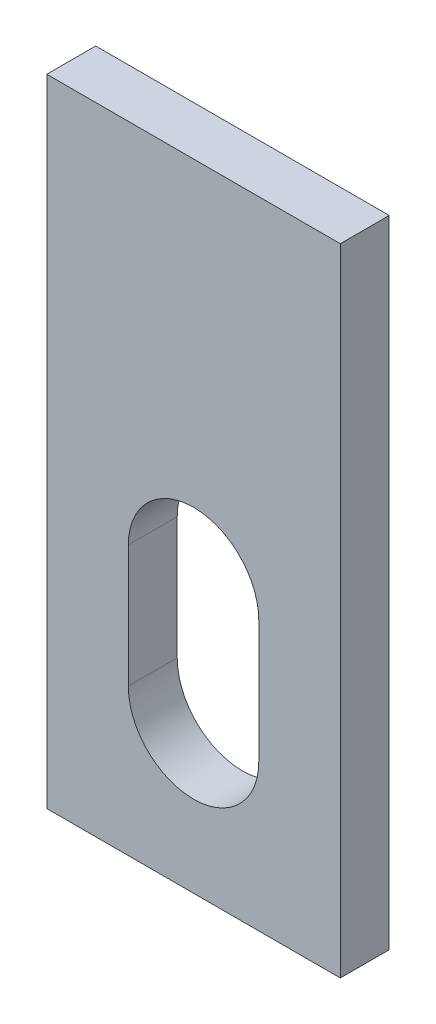
ISO-10303-21;
HEADER;
FILE_DESCRIPTION(('STEP AP214'),'2;1');
FILE_NAME('part.step','',(''),(''),'','','');
FILE_SCHEMA(('AUTOMOTIVE_DESIGN { 1 0 10303 214 1 1 1 1 }'));
ENDSEC;
DATA;
#1=APPLICATION_CONTEXT('core data for automotive mechanical design processes');
#2=APPLICATION_PROTOCOL_DEFINITION('international standard','automotive_design',2000,#1);
#3=PRODUCT_CONTEXT('',#1,'mechanical');
#4=PRODUCT('Part','Part','',(#3));
#5=PRODUCT_RELATED_PRODUCT_CATEGORY('part','',(#4));
#6=PRODUCT_DEFINITION_FORMATION('','',#4);
#7=PRODUCT_DEFINITION_CONTEXT('part definition',#1,'design');
#8=PRODUCT_DEFINITION('design','',#6,#7);
#9=PRODUCT_DEFINITION_SHAPE('','',#8);
#10=(LENGTH_UNIT() NAMED_UNIT(*) SI_UNIT(.MILLI.,.METRE.));
#11=(NAMED_UNIT(*) PLANE_ANGLE_UNIT() SI_UNIT($,.RADIAN.));
#12=(NAMED_UNIT(*) SI_UNIT($,.STERADIAN.) SOLID_ANGLE_UNIT());
#13=UNCERTAINTY_MEASURE_WITH_UNIT(LENGTH_MEASURE(1.E-05),#10,'distance_accuracy_value','');
#14=(GEOMETRIC_REPRESENTATION_CONTEXT(3) GLOBAL_UNCERTAINTY_ASSIGNED_CONTEXT((#13)) GLOBAL_UNIT_ASSIGNED_CONTEXT((#10,
#11,#12)) REPRESENTATION_CONTEXT('',''));
#15=CARTESIAN_POINT('',(0.,0.,0.));
#16=DIRECTION('',(0.,0.,1.));
#17=DIRECTION('',(1.,0.,0.));
#18=AXIS2_PLACEMENT_3D('',#15,#16,#17);
#19=CARTESIAN_POINT('',(0.,0.,10.));
#20=DIRECTION('',(0.,0.,1.));
#21=DIRECTION('',(1.,0.,0.));
#22=AXIS2_PLACEMENT_3D('',#19,#20,#21);
#23=PLANE('',#22);
#24=DIRECTION('',(0.,-1.,0.));
#25=VECTOR('',#24,1.);
#26=CARTESIAN_POINT('',(0.,0.,10.));
#27=LINE('',#26,#25);
#28=CARTESIAN_POINT('',(0.,0.,10.));
#29=VERTEX_POINT('',#28);
#30=CARTESIAN_POINT('',(0.,-130.,10.));
#31=VERTEX_POINT('',#30);
#32=EDGE_CURVE('E136',#29,#31,#27,.T.);
#33=ORIENTED_EDGE('',*,*,#32,.T.);
#34=DIRECTION('',(1.,0.,0.));
#35=VECTOR('',#34,1.);
#36=CARTESIAN_POINT('',(0.,-130.,10.));
#37=LINE('',#36,#35);
#38=CARTESIAN_POINT('',(60.,-130.,10.));
#39=VERTEX_POINT('',#38);
#40=EDGE_CURVE('E139',#31,#39,#37,.T.);
#41=ORIENTED_EDGE('',*,*,#40,.T.);
#42=DIRECTION('',(0.,1.,0.));
#43=VECTOR('',#42,1.);
#44=CARTESIAN_POINT('',(60.,0.,10.));
#45=LINE('',#44,#43);
#46=CARTESIAN_POINT('',(60.,0.,10.));
#47=VERTEX_POINT('',#46);
#48=EDGE_CURVE('E142',#39,#47,#45,.T.);
#49=ORIENTED_EDGE('',*,*,#48,.T.);
#50=DIRECTION('',(-1.,0.,0.));
#51=VECTOR('',#50,1.);
#52=CARTESIAN_POINT('',(0.,0.,10.));
#53=LINE('',#52,#51);
#54=EDGE_CURVE('E144',#47,#29,#53,.T.);
#55=ORIENTED_EDGE('',*,*,#54,.T.);
#56=EDGE_LOOP('',(#33,#41,#49,#55));
#57=FACE_BOUND('',#56,.T.);
#58=DIRECTION('',(0.,1.,0.));
#59=VECTOR('',#58,1.);
#60=CARTESIAN_POINT('',(43.3374840169176,-100.,10.));
#61=LINE('',#60,#59);
#62=CARTESIAN_POINT('',(43.3374840169176,-100.,10.));
#63=VERTEX_POINT('',#62);
#64=CARTESIAN_POINT('',(43.3374840169176,-75.,10.));
#65=VERTEX_POINT('',#64);
#66=EDGE_CURVE('E108',#63,#65,#61,.T.);
#67=ORIENTED_EDGE('',*,*,#66,.F.);
#68=CARTESIAN_POINT('',(30.,-100.,10.));
#69=DIRECTION('',(0.,0.,1.));
#70=DIRECTION('',(1.,0.,0.));
#71=AXIS2_PLACEMENT_3D('',#68,#69,#70);
#72=CIRCLE('',#71,13.3374840169175);
#73=CARTESIAN_POINT('',(16.6625159830825,-100.,10.));
#74=VERTEX_POINT('',#73);
#75=EDGE_CURVE('E100',#74,#63,#72,.T.);
#76=ORIENTED_EDGE('',*,*,#75,.F.);
#77=DIRECTION('',(0.,-1.,0.));
#78=VECTOR('',#77,1.);
#79=CARTESIAN_POINT('',(16.6625159830825,-100.,10.));
#80=LINE('',#79,#78);
#81=CARTESIAN_POINT('',(16.6625159830825,-75.,10.));
#82=VERTEX_POINT('',#81);
#83=EDGE_CURVE('E122',#82,#74,#80,.T.);
#84=ORIENTED_EDGE('',*,*,#83,.F.);
#85=CARTESIAN_POINT('',(30.,-75.,10.));
#86=DIRECTION('',(0.,0.,1.));
#87=DIRECTION('',(1.,0.,0.));
#88=AXIS2_PLACEMENT_3D('',#85,#86,#87);
#89=CIRCLE('',#88,13.3374840169175);
#90=EDGE_CURVE('E120',#65,#82,#89,.T.);
#91=ORIENTED_EDGE('',*,*,#90,.F.);
#92=EDGE_LOOP('',(#67,#76,#84,#91));
#93=FACE_BOUND('',#92,.T.);
#94=ADVANCED_FACE('F35',(#57,#93),#23,.T.);
#95=CARTESIAN_POINT('',(0.,0.,0.));
#96=DIRECTION('',(0.,0.,1.));
#97=DIRECTION('',(1.,0.,0.));
#98=AXIS2_PLACEMENT_3D('',#95,#96,#97);
#99=PLANE('',#98);
#100=DIRECTION('',(0.,-1.,0.));
#101=VECTOR('',#100,1.);
#102=CARTESIAN_POINT('',(0.,0.,0.));
#103=LINE('',#102,#101);
#104=CARTESIAN_POINT('',(0.,0.,0.));
#105=VERTEX_POINT('',#104);
#106=CARTESIAN_POINT('',(0.,-130.,0.));
#107=VERTEX_POINT('',#106);
#108=EDGE_CURVE('E116',#105,#107,#103,.T.);
#109=ORIENTED_EDGE('',*,*,#108,.F.);
#110=DIRECTION('',(-1.,0.,0.));
#111=VECTOR('',#110,1.);
#112=CARTESIAN_POINT('',(0.,0.,0.));
#113=LINE('',#112,#111);
#114=CARTESIAN_POINT('',(60.,0.,0.));
#115=VERTEX_POINT('',#114);
#116=EDGE_CURVE('E140',#115,#105,#113,.T.);
#117=ORIENTED_EDGE('',*,*,#116,.F.);
#118=DIRECTION('',(0.,1.,0.));
#119=VECTOR('',#118,1.);
#120=CARTESIAN_POINT('',(60.,0.,0.));
#121=LINE('',#120,#119);
#122=CARTESIAN_POINT('',(60.,-130.,0.));
#123=VERTEX_POINT('',#122);
#124=EDGE_CURVE('E151',#123,#115,#121,.T.);
#125=ORIENTED_EDGE('',*,*,#124,.F.);
#126=DIRECTION('',(1.,0.,0.));
#127=VECTOR('',#126,1.);
#128=CARTESIAN_POINT('',(0.,-130.,0.));
#129=LINE('',#128,#127);
#130=EDGE_CURVE('E149',#107,#123,#129,.T.);
#131=ORIENTED_EDGE('',*,*,#130,.F.);
#132=EDGE_LOOP('',(#109,#117,#125,#131));
#133=FACE_BOUND('',#132,.T.);
#134=CARTESIAN_POINT('',(30.,-100.,0.));
#135=DIRECTION('',(0.,0.,1.));
#136=DIRECTION('',(1.,0.,0.));
#137=AXIS2_PLACEMENT_3D('',#134,#135,#136);
#138=CIRCLE('',#137,13.3374840169175);
#139=CARTESIAN_POINT('',(16.6625159830825,-100.,0.));
#140=VERTEX_POINT('',#139);
#141=CARTESIAN_POINT('',(43.3374840169176,-100.,0.));
#142=VERTEX_POINT('',#141);
#143=EDGE_CURVE('E58',#140,#142,#138,.T.);
#144=ORIENTED_EDGE('',*,*,#143,.T.);
#145=DIRECTION('',(0.,1.,0.));
#146=VECTOR('',#145,1.);
#147=CARTESIAN_POINT('',(43.3374840169176,-100.,0.));
#148=LINE('',#147,#146);
#149=CARTESIAN_POINT('',(43.3374840169176,-75.,0.));
#150=VERTEX_POINT('',#149);
#151=EDGE_CURVE('E115',#142,#150,#148,.T.);
#152=ORIENTED_EDGE('',*,*,#151,.T.);
#153=CARTESIAN_POINT('',(30.,-75.,0.));
#154=DIRECTION('',(0.,0.,1.));
#155=DIRECTION('',(1.,0.,0.));
#156=AXIS2_PLACEMENT_3D('',#153,#154,#155);
#157=CIRCLE('',#156,13.3374840169175);
#158=CARTESIAN_POINT('',(16.6625159830825,-75.,0.));
#159=VERTEX_POINT('',#158);
#160=EDGE_CURVE('E128',#150,#159,#157,.T.);
#161=ORIENTED_EDGE('',*,*,#160,.T.);
#162=DIRECTION('',(0.,-1.,0.));
#163=VECTOR('',#162,1.);
#164=CARTESIAN_POINT('',(16.6625159830825,-100.,0.));
#165=LINE('',#164,#163);
#166=EDGE_CURVE('E109',#159,#140,#165,.T.);
#167=ORIENTED_EDGE('',*,*,#166,.T.);
#168=EDGE_LOOP('',(#144,#152,#161,#167));
#169=FACE_BOUND('',#168,.T.);
#170=ADVANCED_FACE('F169',(#133,#169),#99,.F.);
#171=CARTESIAN_POINT('',(0.,0.,10.));
#172=DIRECTION('',(1.,0.,0.));
#173=DIRECTION('',(0.,1.,0.));
#174=AXIS2_PLACEMENT_3D('',#171,#172,#173);
#175=PLANE('',#174);
#176=ORIENTED_EDGE('',*,*,#108,.T.);
#177=DIRECTION('',(0.,0.,-1.));
#178=VECTOR('',#177,1.);
#179=CARTESIAN_POINT('',(0.,-130.,10.));
#180=LINE('',#179,#178);
#181=EDGE_CURVE('E11',#31,#107,#180,.T.);
#182=ORIENTED_EDGE('',*,*,#181,.F.);
#183=ORIENTED_EDGE('',*,*,#32,.F.);
#184=DIRECTION('',(0.,0.,-1.));
#185=VECTOR('',#184,1.);
#186=CARTESIAN_POINT('',(0.,0.,10.));
#187=LINE('',#186,#185);
#188=EDGE_CURVE('E146',#29,#105,#187,.T.);
#189=ORIENTED_EDGE('',*,*,#188,.T.);
#190=EDGE_LOOP('',(#176,#182,#183,#189));
#191=FACE_BOUND('',#190,.T.);
#192=ADVANCED_FACE('F37',(#191),#175,.F.);
#193=CARTESIAN_POINT('',(0.,-130.,10.));
#194=DIRECTION('',(0.,1.,0.));
#195=DIRECTION('',(0.,0.,1.));
#196=AXIS2_PLACEMENT_3D('',#193,#194,#195);
#197=PLANE('',#196);
#198=ORIENTED_EDGE('',*,*,#130,.T.);
#199=DIRECTION('',(0.,0.,-1.));
#200=VECTOR('',#199,1.);
#201=CARTESIAN_POINT('',(60.,-130.,10.));
#202=LINE('',#201,#200);
#203=EDGE_CURVE('E43',#39,#123,#202,.T.);
#204=ORIENTED_EDGE('',*,*,#203,.F.);
#205=ORIENTED_EDGE('',*,*,#40,.F.);
#206=ORIENTED_EDGE('',*,*,#181,.T.);
#207=EDGE_LOOP('',(#198,#204,#205,#206));
#208=FACE_BOUND('',#207,.T.);
#209=ADVANCED_FACE('F179',(#208),#197,.F.);
#210=CARTESIAN_POINT('',(60.,0.,10.));
#211=DIRECTION('',(-1.,0.,0.));
#212=DIRECTION('',(0.,-1.,0.));
#213=AXIS2_PLACEMENT_3D('',#210,#211,#212);
#214=PLANE('',#213);
#215=ORIENTED_EDGE('',*,*,#124,.T.);
#216=DIRECTION('',(0.,0.,-1.));
#217=VECTOR('',#216,1.);
#218=CARTESIAN_POINT('',(60.,0.,10.));
#219=LINE('',#218,#217);
#220=EDGE_CURVE('E156',#47,#115,#219,.T.);
#221=ORIENTED_EDGE('',*,*,#220,.F.);
#222=ORIENTED_EDGE('',*,*,#48,.F.);
#223=ORIENTED_EDGE('',*,*,#203,.T.);
#224=EDGE_LOOP('',(#215,#221,#222,#223));
#225=FACE_BOUND('',#224,.T.);
#226=ADVANCED_FACE('F163',(#225),#214,.F.);
#227=CARTESIAN_POINT('',(0.,0.,10.));
#228=DIRECTION('',(0.,-1.,0.));
#229=DIRECTION('',(0.,0.,-1.));
#230=AXIS2_PLACEMENT_3D('',#227,#228,#229);
#231=PLANE('',#230);
#232=ORIENTED_EDGE('',*,*,#116,.T.);
#233=ORIENTED_EDGE('',*,*,#188,.F.);
#234=ORIENTED_EDGE('',*,*,#54,.F.);
#235=ORIENTED_EDGE('',*,*,#220,.T.);
#236=EDGE_LOOP('',(#232,#233,#234,#235));
#237=FACE_BOUND('',#236,.T.);
#238=ADVANCED_FACE('F173',(#237),#231,.F.);
#239=CARTESIAN_POINT('',(30.,-100.,10.));
#240=DIRECTION('',(0.,0.,-1.));
#241=DIRECTION('',(-1.,0.,0.));
#242=AXIS2_PLACEMENT_3D('',#239,#240,#241);
#243=CYLINDRICAL_SURFACE('',#242,13.3374840169175);
#244=ORIENTED_EDGE('',*,*,#143,.F.);
#245=DIRECTION('',(0.,0.,-1.));
#246=VECTOR('',#245,1.);
#247=CARTESIAN_POINT('',(16.6625159830825,-100.,10.));
#248=LINE('',#247,#246);
#249=EDGE_CURVE('E104',#74,#140,#248,.T.);
#250=ORIENTED_EDGE('',*,*,#249,.F.);
#251=ORIENTED_EDGE('',*,*,#75,.T.);
#252=DIRECTION('',(0.,0.,-1.));
#253=VECTOR('',#252,1.);
#254=CARTESIAN_POINT('',(43.3374840169176,-100.,10.));
#255=LINE('',#254,#253);
#256=EDGE_CURVE('E103',#63,#142,#255,.T.);
#257=ORIENTED_EDGE('',*,*,#256,.T.);
#258=EDGE_LOOP('',(#244,#250,#251,#257));
#259=FACE_BOUND('',#258,.T.);
#260=ADVANCED_FACE('F102',(#259),#243,.F.);
#261=CARTESIAN_POINT('',(43.3374840169176,-100.,10.));
#262=DIRECTION('',(-1.,0.,0.));
#263=DIRECTION('',(0.,0.,1.));
#264=AXIS2_PLACEMENT_3D('',#261,#262,#263);
#265=PLANE('',#264);
#266=ORIENTED_EDGE('',*,*,#151,.F.);
#267=ORIENTED_EDGE('',*,*,#256,.F.);
#268=ORIENTED_EDGE('',*,*,#66,.T.);
#269=DIRECTION('',(0.,0.,-1.));
#270=VECTOR('',#269,1.);
#271=CARTESIAN_POINT('',(43.3374840169176,-75.,10.));
#272=LINE('',#271,#270);
#273=EDGE_CURVE('E117',#65,#150,#272,.T.);
#274=ORIENTED_EDGE('',*,*,#273,.T.);
#275=EDGE_LOOP('',(#266,#267,#268,#274));
#276=FACE_BOUND('',#275,.T.);
#277=ADVANCED_FACE('F112',(#276),#265,.T.);
#278=CARTESIAN_POINT('',(30.,-75.,10.));
#279=DIRECTION('',(0.,0.,-1.));
#280=DIRECTION('',(-1.,0.,0.));
#281=AXIS2_PLACEMENT_3D('',#278,#279,#280);
#282=CYLINDRICAL_SURFACE('',#281,13.3374840169175);
#283=ORIENTED_EDGE('',*,*,#160,.F.);
#284=ORIENTED_EDGE('',*,*,#273,.F.);
#285=ORIENTED_EDGE('',*,*,#90,.T.);
#286=DIRECTION('',(0.,0.,-1.));
#287=VECTOR('',#286,1.);
#288=CARTESIAN_POINT('',(16.6625159830825,-75.,10.));
#289=LINE('',#288,#287);
#290=EDGE_CURVE('E50',#82,#159,#289,.T.);
#291=ORIENTED_EDGE('',*,*,#290,.T.);
#292=EDGE_LOOP('',(#283,#284,#285,#291));
#293=FACE_BOUND('',#292,.T.);
#294=ADVANCED_FACE('F202',(#293),#282,.F.);
#295=CARTESIAN_POINT('',(16.6625159830825,-100.,10.));
#296=DIRECTION('',(1.,0.,0.));
#297=DIRECTION('',(0.,0.,-1.));
#298=AXIS2_PLACEMENT_3D('',#295,#296,#297);
#299=PLANE('',#298);
#300=ORIENTED_EDGE('',*,*,#166,.F.);
#301=ORIENTED_EDGE('',*,*,#290,.F.);
#302=ORIENTED_EDGE('',*,*,#83,.T.);
#303=ORIENTED_EDGE('',*,*,#249,.T.);
#304=EDGE_LOOP('',(#300,#301,#302,#303));
#305=FACE_BOUND('',#304,.T.);
#306=ADVANCED_FACE('F206',(#305),#299,.T.);
#307=CLOSED_SHELL('',(#94,#170,#192,#209,#226,#238,#260,#277,#294,#306));
#308=MANIFOLD_SOLID_BREP('B2',#307);
#309=ADVANCED_BREP_SHAPE_REPRESENTATION('',(#18,#308),#14);
#310=SHAPE_DEFINITION_REPRESENTATION(#9,#309);
ENDSEC;
END-ISO-10303-21;
